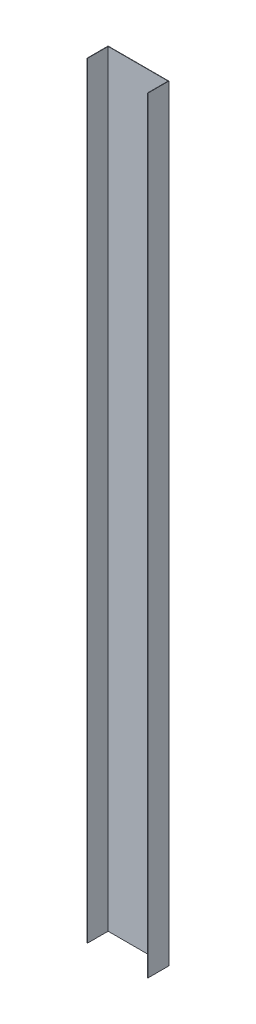
ISO-10303-21;
HEADER;
FILE_DESCRIPTION(('STEP AP214'),'2;1');
FILE_NAME('part.step','',(''),(''),'','','');
FILE_SCHEMA(('AUTOMOTIVE_DESIGN { 1 0 10303 214 1 1 1 1 }'));
ENDSEC;
DATA;
#1=APPLICATION_CONTEXT('core data for automotive mechanical design processes');
#2=APPLICATION_PROTOCOL_DEFINITION('international standard','automotive_design',2000,#1);
#3=PRODUCT_CONTEXT('',#1,'mechanical');
#4=PRODUCT('Part','Part','',(#3));
#5=PRODUCT_RELATED_PRODUCT_CATEGORY('part','',(#4));
#6=PRODUCT_DEFINITION_FORMATION('','',#4);
#7=PRODUCT_DEFINITION_CONTEXT('part definition',#1,'design');
#8=PRODUCT_DEFINITION('design','',#6,#7);
#9=PRODUCT_DEFINITION_SHAPE('','',#8);
#10=(LENGTH_UNIT() NAMED_UNIT(*) SI_UNIT(.MILLI.,.METRE.));
#11=(NAMED_UNIT(*) PLANE_ANGLE_UNIT() SI_UNIT($,.RADIAN.));
#12=(NAMED_UNIT(*) SI_UNIT($,.STERADIAN.) SOLID_ANGLE_UNIT());
#13=UNCERTAINTY_MEASURE_WITH_UNIT(LENGTH_MEASURE(1.E-05),#10,'distance_accuracy_value','');
#14=(GEOMETRIC_REPRESENTATION_CONTEXT(3) GLOBAL_UNCERTAINTY_ASSIGNED_CONTEXT((#13)) GLOBAL_UNIT_ASSIGNED_CONTEXT((#10,
#11,#12)) REPRESENTATION_CONTEXT('',''));
#15=CARTESIAN_POINT('',(0.,0.,0.));
#16=DIRECTION('',(0.,0.,1.));
#17=DIRECTION('',(1.,0.,0.));
#18=AXIS2_PLACEMENT_3D('',#15,#16,#17);
#19=CARTESIAN_POINT('',(-0.530999999999989,1162.05,0.));
#20=DIRECTION('',(0.,0.,-1.));
#21=DIRECTION('',(-1.,0.,0.));
#22=AXIS2_PLACEMENT_3D('',#19,#20,#21);
#23=PLANE('',#22);
#24=DIRECTION('',(1.,0.,0.));
#25=VECTOR('',#24,1.);
#26=CARTESIAN_POINT('',(-0.530999999999989,0.,0.));
#27=LINE('',#26,#25);
#28=CARTESIAN_POINT('',(-0.530999999999989,0.,0.));
#29=VERTEX_POINT('',#28);
#30=CARTESIAN_POINT('',(0.,0.,0.));
#31=VERTEX_POINT('',#30);
#32=EDGE_CURVE('E129',#29,#31,#27,.T.);
#33=ORIENTED_EDGE('',*,*,#32,.T.);
#34=DIRECTION('',(0.,-1.,0.));
#35=VECTOR('',#34,1.);
#36=CARTESIAN_POINT('',(0.,1162.05,0.));
#37=LINE('',#36,#35);
#38=CARTESIAN_POINT('',(0.,1162.05,0.));
#39=VERTEX_POINT('',#38);
#40=EDGE_CURVE('E11',#39,#31,#37,.T.);
#41=ORIENTED_EDGE('',*,*,#40,.F.);
#42=DIRECTION('',(1.,0.,0.));
#43=VECTOR('',#42,1.);
#44=CARTESIAN_POINT('',(-0.530999999999989,1162.05,0.));
#45=LINE('',#44,#43);
#46=CARTESIAN_POINT('',(-0.530999999999989,1162.05,0.));
#47=VERTEX_POINT('',#46);
#48=EDGE_CURVE('E143',#47,#39,#45,.T.);
#49=ORIENTED_EDGE('',*,*,#48,.F.);
#50=DIRECTION('',(0.,-1.,0.));
#51=VECTOR('',#50,1.);
#52=CARTESIAN_POINT('',(-0.530999999999989,1162.05,0.));
#53=LINE('',#52,#51);
#54=EDGE_CURVE('E125',#47,#29,#53,.T.);
#55=ORIENTED_EDGE('',*,*,#54,.T.);
#56=EDGE_LOOP('',(#33,#41,#49,#55));
#57=FACE_BOUND('',#56,.T.);
#58=ADVANCED_FACE('F33',(#57),#23,.F.);
#59=CARTESIAN_POINT('',(0.,1162.05,0.));
#60=DIRECTION('',(-1.,0.,0.));
#61=DIRECTION('',(0.,0.,1.));
#62=AXIS2_PLACEMENT_3D('',#59,#60,#61);
#63=PLANE('',#62);
#64=DIRECTION('',(0.,0.,-1.));
#65=VECTOR('',#64,1.);
#66=CARTESIAN_POINT('',(0.,0.,0.));
#67=LINE('',#66,#65);
#68=CARTESIAN_POINT('',(0.,0.,-31.219));
#69=VERTEX_POINT('',#68);
#70=EDGE_CURVE('E132',#31,#69,#67,.T.);
#71=ORIENTED_EDGE('',*,*,#70,.T.);
#72=DIRECTION('',(0.,-1.,0.));
#73=VECTOR('',#72,1.);
#74=CARTESIAN_POINT('',(0.,1162.05,-31.219));
#75=LINE('',#74,#73);
#76=CARTESIAN_POINT('',(0.,1162.05,-31.219));
#77=VERTEX_POINT('',#76);
#78=EDGE_CURVE('E41',#77,#69,#75,.T.);
#79=ORIENTED_EDGE('',*,*,#78,.F.);
#80=DIRECTION('',(0.,0.,-1.));
#81=VECTOR('',#80,1.);
#82=CARTESIAN_POINT('',(0.,1162.05,0.));
#83=LINE('',#82,#81);
#84=EDGE_CURVE('E92',#39,#77,#83,.T.);
#85=ORIENTED_EDGE('',*,*,#84,.F.);
#86=ORIENTED_EDGE('',*,*,#40,.T.);
#87=EDGE_LOOP('',(#71,#79,#85,#86));
#88=FACE_BOUND('',#87,.T.);
#89=ADVANCED_FACE('F178',(#88),#63,.F.);
#90=CARTESIAN_POINT('',(0.,1162.05,-31.219));
#91=DIRECTION('',(0.,0.,-1.));
#92=DIRECTION('',(-1.,0.,0.));
#93=AXIS2_PLACEMENT_3D('',#90,#91,#92);
#94=PLANE('',#93);
#95=DIRECTION('',(1.,0.,0.));
#96=VECTOR('',#95,1.);
#97=CARTESIAN_POINT('',(0.,0.,-31.219));
#98=LINE('',#97,#96);
#99=CARTESIAN_POINT('',(91.013,0.,-31.219));
#100=VERTEX_POINT('',#99);
#101=EDGE_CURVE('E134',#69,#100,#98,.T.);
#102=ORIENTED_EDGE('',*,*,#101,.T.);
#103=DIRECTION('',(0.,-1.,0.));
#104=VECTOR('',#103,1.);
#105=CARTESIAN_POINT('',(91.013,1162.05,-31.219));
#106=LINE('',#105,#104);
#107=CARTESIAN_POINT('',(91.013,1162.05,-31.219));
#108=VERTEX_POINT('',#107);
#109=EDGE_CURVE('E150',#108,#100,#106,.T.);
#110=ORIENTED_EDGE('',*,*,#109,.F.);
#111=DIRECTION('',(1.,0.,0.));
#112=VECTOR('',#111,1.);
#113=CARTESIAN_POINT('',(0.,1162.05,-31.219));
#114=LINE('',#113,#112);
#115=EDGE_CURVE('E158',#77,#108,#114,.T.);
#116=ORIENTED_EDGE('',*,*,#115,.F.);
#117=ORIENTED_EDGE('',*,*,#78,.T.);
#118=EDGE_LOOP('',(#102,#110,#116,#117));
#119=FACE_BOUND('',#118,.T.);
#120=ADVANCED_FACE('F156',(#119),#94,.F.);
#121=CARTESIAN_POINT('',(91.013,1162.05,-31.219));
#122=DIRECTION('',(1.,0.,0.));
#123=DIRECTION('',(0.,0.,-1.));
#124=AXIS2_PLACEMENT_3D('',#121,#122,#123);
#125=PLANE('',#124);
#126=DIRECTION('',(0.,0.,1.));
#127=VECTOR('',#126,1.);
#128=CARTESIAN_POINT('',(91.013,0.,-31.219));
#129=LINE('',#128,#127);
#130=CARTESIAN_POINT('',(91.013,0.,0.));
#131=VERTEX_POINT('',#130);
#132=EDGE_CURVE('E136',#100,#131,#129,.T.);
#133=ORIENTED_EDGE('',*,*,#132,.T.);
#134=DIRECTION('',(0.,-1.,0.));
#135=VECTOR('',#134,1.);
#136=CARTESIAN_POINT('',(91.013,1162.05,0.));
#137=LINE('',#136,#135);
#138=CARTESIAN_POINT('',(91.013,1162.05,0.));
#139=VERTEX_POINT('',#138);
#140=EDGE_CURVE('E147',#139,#131,#137,.T.);
#141=ORIENTED_EDGE('',*,*,#140,.F.);
#142=DIRECTION('',(0.,0.,1.));
#143=VECTOR('',#142,1.);
#144=CARTESIAN_POINT('',(91.013,1162.05,-31.219));
#145=LINE('',#144,#143);
#146=EDGE_CURVE('E170',#108,#139,#145,.T.);
#147=ORIENTED_EDGE('',*,*,#146,.F.);
#148=ORIENTED_EDGE('',*,*,#109,.T.);
#149=EDGE_LOOP('',(#133,#141,#147,#148));
#150=FACE_BOUND('',#149,.T.);
#151=ADVANCED_FACE('F166',(#150),#125,.F.);
#152=CARTESIAN_POINT('',(91.013,1162.05,0.));
#153=DIRECTION('',(0.,0.,-1.));
#154=DIRECTION('',(-1.,0.,0.));
#155=AXIS2_PLACEMENT_3D('',#152,#153,#154);
#156=PLANE('',#155);
#157=DIRECTION('',(1.,0.,0.));
#158=VECTOR('',#157,1.);
#159=CARTESIAN_POINT('',(91.013,0.,0.));
#160=LINE('',#159,#158);
#161=CARTESIAN_POINT('',(91.544,0.,0.));
#162=VERTEX_POINT('',#161);
#163=EDGE_CURVE('E138',#131,#162,#160,.T.);
#164=ORIENTED_EDGE('',*,*,#163,.T.);
#165=DIRECTION('',(0.,-1.,0.));
#166=VECTOR('',#165,1.);
#167=CARTESIAN_POINT('',(91.544,1162.05,0.));
#168=LINE('',#167,#166);
#169=CARTESIAN_POINT('',(91.544,1162.05,0.));
#170=VERTEX_POINT('',#169);
#171=EDGE_CURVE('E120',#170,#162,#168,.T.);
#172=ORIENTED_EDGE('',*,*,#171,.F.);
#173=DIRECTION('',(1.,0.,0.));
#174=VECTOR('',#173,1.);
#175=CARTESIAN_POINT('',(91.013,1162.05,0.));
#176=LINE('',#175,#174);
#177=EDGE_CURVE('E111',#139,#170,#176,.T.);
#178=ORIENTED_EDGE('',*,*,#177,.F.);
#179=ORIENTED_EDGE('',*,*,#140,.T.);
#180=EDGE_LOOP('',(#164,#172,#178,#179));
#181=FACE_BOUND('',#180,.T.);
#182=ADVANCED_FACE('F169',(#181),#156,.F.);
#183=CARTESIAN_POINT('',(91.544,1162.05,0.));
#184=DIRECTION('',(-1.,0.,0.));
#185=DIRECTION('',(0.,0.,1.));
#186=AXIS2_PLACEMENT_3D('',#183,#184,#185);
#187=PLANE('',#186);
#188=DIRECTION('',(0.,0.,-1.));
#189=VECTOR('',#188,1.);
#190=CARTESIAN_POINT('',(91.544,0.,0.));
#191=LINE('',#190,#189);
#192=CARTESIAN_POINT('',(91.544,0.,-31.75));
#193=VERTEX_POINT('',#192);
#194=EDGE_CURVE('E119',#162,#193,#191,.T.);
#195=ORIENTED_EDGE('',*,*,#194,.T.);
#196=DIRECTION('',(0.,-1.,0.));
#197=VECTOR('',#196,1.);
#198=CARTESIAN_POINT('',(91.544,1162.05,-31.75));
#199=LINE('',#198,#197);
#200=CARTESIAN_POINT('',(91.544,1162.05,-31.75));
#201=VERTEX_POINT('',#200);
#202=EDGE_CURVE('E116',#201,#193,#199,.T.);
#203=ORIENTED_EDGE('',*,*,#202,.F.);
#204=DIRECTION('',(0.,0.,-1.));
#205=VECTOR('',#204,1.);
#206=CARTESIAN_POINT('',(91.544,1162.05,0.));
#207=LINE('',#206,#205);
#208=EDGE_CURVE('E105',#170,#201,#207,.T.);
#209=ORIENTED_EDGE('',*,*,#208,.F.);
#210=ORIENTED_EDGE('',*,*,#171,.T.);
#211=EDGE_LOOP('',(#195,#203,#209,#210));
#212=FACE_BOUND('',#211,.T.);
#213=ADVANCED_FACE('F117',(#212),#187,.F.);
#214=CARTESIAN_POINT('',(91.544,1162.05,-31.75));
#215=DIRECTION('',(0.,0.,1.));
#216=DIRECTION('',(1.,0.,0.));
#217=AXIS2_PLACEMENT_3D('',#214,#215,#216);
#218=PLANE('',#217);
#219=DIRECTION('',(-1.,0.,0.));
#220=VECTOR('',#219,1.);
#221=CARTESIAN_POINT('',(91.544,0.,-31.75));
#222=LINE('',#221,#220);
#223=CARTESIAN_POINT('',(-0.530999999999993,0.,-31.75));
#224=VERTEX_POINT('',#223);
#225=EDGE_CURVE('E78',#193,#224,#222,.T.);
#226=ORIENTED_EDGE('',*,*,#225,.T.);
#227=DIRECTION('',(0.,-1.,0.));
#228=VECTOR('',#227,1.);
#229=CARTESIAN_POINT('',(-0.530999999999993,1162.05,-31.75));
#230=LINE('',#229,#228);
#231=CARTESIAN_POINT('',(-0.530999999999993,1162.05,-31.75));
#232=VERTEX_POINT('',#231);
#233=EDGE_CURVE('E121',#232,#224,#230,.T.);
#234=ORIENTED_EDGE('',*,*,#233,.F.);
#235=DIRECTION('',(-1.,0.,0.));
#236=VECTOR('',#235,1.);
#237=CARTESIAN_POINT('',(91.544,1162.05,-31.75));
#238=LINE('',#237,#236);
#239=EDGE_CURVE('E109',#201,#232,#238,.T.);
#240=ORIENTED_EDGE('',*,*,#239,.F.);
#241=ORIENTED_EDGE('',*,*,#202,.T.);
#242=EDGE_LOOP('',(#226,#234,#240,#241));
#243=FACE_BOUND('',#242,.T.);
#244=ADVANCED_FACE('F123',(#243),#218,.F.);
#245=CARTESIAN_POINT('',(-0.530999999999993,1162.05,-31.75));
#246=DIRECTION('',(1.,0.,0.));
#247=DIRECTION('',(0.,0.,-1.));
#248=AXIS2_PLACEMENT_3D('',#245,#246,#247);
#249=PLANE('',#248);
#250=DIRECTION('',(0.,0.,1.));
#251=VECTOR('',#250,1.);
#252=CARTESIAN_POINT('',(-0.530999999999993,0.,-31.75));
#253=LINE('',#252,#251);
#254=EDGE_CURVE('E84',#224,#29,#253,.T.);
#255=ORIENTED_EDGE('',*,*,#254,.T.);
#256=ORIENTED_EDGE('',*,*,#54,.F.);
#257=DIRECTION('',(0.,0.,1.));
#258=VECTOR('',#257,1.);
#259=CARTESIAN_POINT('',(-0.530999999999993,1162.05,-31.75));
#260=LINE('',#259,#258);
#261=EDGE_CURVE('E49',#232,#47,#260,.T.);
#262=ORIENTED_EDGE('',*,*,#261,.F.);
#263=ORIENTED_EDGE('',*,*,#233,.T.);
#264=EDGE_LOOP('',(#255,#256,#262,#263));
#265=FACE_BOUND('',#264,.T.);
#266=ADVANCED_FACE('F194',(#265),#249,.F.);
#267=CARTESIAN_POINT('',(0.,1162.05,0.));
#268=DIRECTION('',(0.,1.,0.));
#269=DIRECTION('',(0.,0.,1.));
#270=AXIS2_PLACEMENT_3D('',#267,#268,#269);
#271=PLANE('',#270);
#272=ORIENTED_EDGE('',*,*,#48,.T.);
#273=ORIENTED_EDGE('',*,*,#84,.T.);
#274=ORIENTED_EDGE('',*,*,#115,.T.);
#275=ORIENTED_EDGE('',*,*,#146,.T.);
#276=ORIENTED_EDGE('',*,*,#177,.T.);
#277=ORIENTED_EDGE('',*,*,#208,.T.);
#278=ORIENTED_EDGE('',*,*,#239,.T.);
#279=ORIENTED_EDGE('',*,*,#261,.T.);
#280=EDGE_LOOP('',(#272,#273,#274,#275,#276,#277,#278,#279));
#281=FACE_BOUND('',#280,.T.);
#282=ADVANCED_FACE('F107',(#281),#271,.T.);
#283=CARTESIAN_POINT('',(0.,0.,0.));
#284=DIRECTION('',(0.,1.,0.));
#285=DIRECTION('',(0.,0.,1.));
#286=AXIS2_PLACEMENT_3D('',#283,#284,#285);
#287=PLANE('',#286);
#288=ORIENTED_EDGE('',*,*,#32,.F.);
#289=ORIENTED_EDGE('',*,*,#254,.F.);
#290=ORIENTED_EDGE('',*,*,#225,.F.);
#291=ORIENTED_EDGE('',*,*,#194,.F.);
#292=ORIENTED_EDGE('',*,*,#163,.F.);
#293=ORIENTED_EDGE('',*,*,#132,.F.);
#294=ORIENTED_EDGE('',*,*,#101,.F.);
#295=ORIENTED_EDGE('',*,*,#70,.F.);
#296=EDGE_LOOP('',(#288,#289,#290,#291,#292,#293,#294,#295));
#297=FACE_BOUND('',#296,.T.);
#298=ADVANCED_FACE('F162',(#297),#287,.F.);
#299=CLOSED_SHELL('',(#58,#89,#120,#151,#182,#213,#244,#266,#282,#298));
#300=MANIFOLD_SOLID_BREP('B2',#299);
#301=ADVANCED_BREP_SHAPE_REPRESENTATION('',(#18,#300),#14);
#302=SHAPE_DEFINITION_REPRESENTATION(#9,#301);
ENDSEC;
END-ISO-10303-21;
